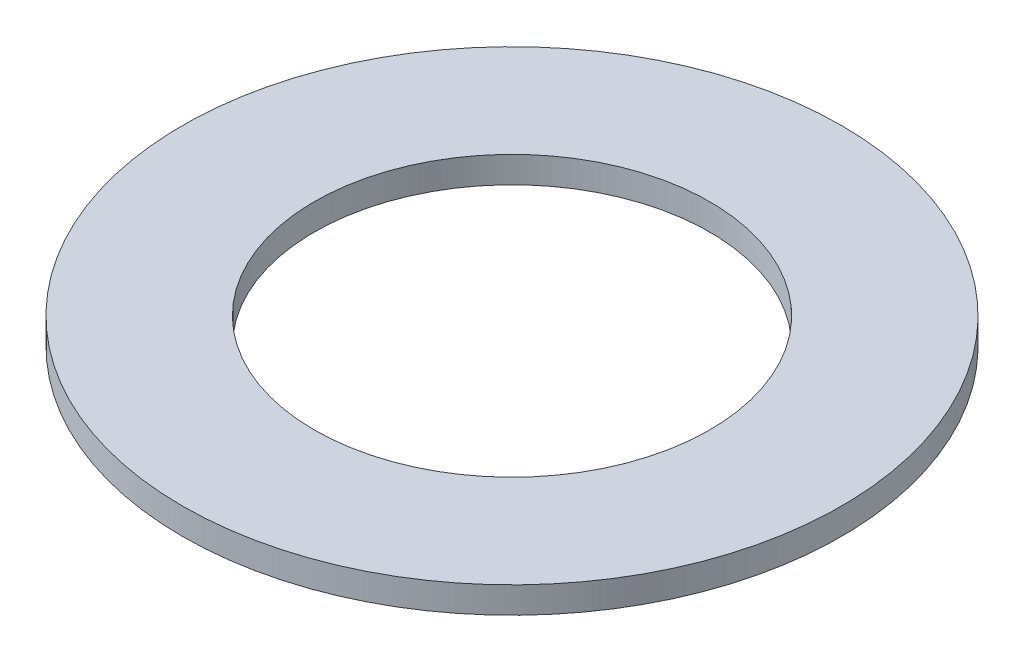
ISO-10303-21;
HEADER;
FILE_DESCRIPTION(('STEP AP214'),'2;1');
FILE_NAME('part.step','',(''),(''),'','','');
FILE_SCHEMA(('AUTOMOTIVE_DESIGN { 1 0 10303 214 1 1 1 1 }'));
ENDSEC;
DATA;
#1=APPLICATION_CONTEXT('core data for automotive mechanical design processes');
#2=APPLICATION_PROTOCOL_DEFINITION('international standard','automotive_design',2000,#1);
#3=PRODUCT_CONTEXT('',#1,'mechanical');
#4=PRODUCT('Part','Part','',(#3));
#5=PRODUCT_RELATED_PRODUCT_CATEGORY('part','',(#4));
#6=PRODUCT_DEFINITION_FORMATION('','',#4);
#7=PRODUCT_DEFINITION_CONTEXT('part definition',#1,'design');
#8=PRODUCT_DEFINITION('design','',#6,#7);
#9=PRODUCT_DEFINITION_SHAPE('','',#8);
#10=(LENGTH_UNIT() NAMED_UNIT(*) SI_UNIT(.MILLI.,.METRE.));
#11=(NAMED_UNIT(*) PLANE_ANGLE_UNIT() SI_UNIT($,.RADIAN.));
#12=(NAMED_UNIT(*) SI_UNIT($,.STERADIAN.) SOLID_ANGLE_UNIT());
#13=UNCERTAINTY_MEASURE_WITH_UNIT(LENGTH_MEASURE(1.E-05),#10,'distance_accuracy_value','');
#14=(GEOMETRIC_REPRESENTATION_CONTEXT(3) GLOBAL_UNCERTAINTY_ASSIGNED_CONTEXT((#13)) GLOBAL_UNIT_ASSIGNED_CONTEXT((#10,
#11,#12)) REPRESENTATION_CONTEXT('',''));
#15=CARTESIAN_POINT('',(0.,0.,0.));
#16=DIRECTION('',(0.,0.,1.));
#17=DIRECTION('',(1.,0.,0.));
#18=AXIS2_PLACEMENT_3D('',#15,#16,#17);
#19=CARTESIAN_POINT('',(0.,0.1,0.));
#20=DIRECTION('',(0.,1.,0.));
#21=DIRECTION('',(0.,0.,1.));
#22=AXIS2_PLACEMENT_3D('',#19,#20,#21);
#23=PLANE('',#22);
#24=CARTESIAN_POINT('',(0.,0.1,0.));
#25=DIRECTION('',(0.,1.,0.));
#26=DIRECTION('',(0.,0.,1.));
#27=AXIS2_PLACEMENT_3D('',#24,#25,#26);
#28=CIRCLE('',#27,2.5);
#29=CARTESIAN_POINT('',(0.,0.1,2.5));
#30=VERTEX_POINT('',#29);
#31=EDGE_CURVE('E10',#30,#30,#28,.T.);
#32=ORIENTED_EDGE('',*,*,#31,.T.);
#33=EDGE_LOOP('',(#32));
#34=FACE_BOUND('',#33,.T.);
#35=CARTESIAN_POINT('',(0.,0.1,0.));
#36=DIRECTION('',(0.,1.,0.));
#37=DIRECTION('',(0.,0.,1.));
#38=AXIS2_PLACEMENT_3D('',#35,#36,#37);
#39=CIRCLE('',#38,1.5);
#40=CARTESIAN_POINT('',(0.,0.1,1.5));
#41=VERTEX_POINT('',#40);
#42=EDGE_CURVE('E44',#41,#41,#39,.T.);
#43=ORIENTED_EDGE('',*,*,#42,.F.);
#44=EDGE_LOOP('',(#43));
#45=FACE_BOUND('',#44,.T.);
#46=ADVANCED_FACE('F33',(#34,#45),#23,.T.);
#47=CARTESIAN_POINT('',(0.,-0.1,0.));
#48=DIRECTION('',(0.,1.,0.));
#49=DIRECTION('',(0.,0.,1.));
#50=AXIS2_PLACEMENT_3D('',#47,#48,#49);
#51=PLANE('',#50);
#52=CARTESIAN_POINT('',(0.,-0.1,0.));
#53=DIRECTION('',(0.,1.,0.));
#54=DIRECTION('',(0.,0.,1.));
#55=AXIS2_PLACEMENT_3D('',#52,#53,#54);
#56=CIRCLE('',#55,2.5);
#57=CARTESIAN_POINT('',(0.,-0.1,2.5));
#58=VERTEX_POINT('',#57);
#59=EDGE_CURVE('E37',#58,#58,#56,.T.);
#60=ORIENTED_EDGE('',*,*,#59,.F.);
#61=EDGE_LOOP('',(#60));
#62=FACE_BOUND('',#61,.T.);
#63=CARTESIAN_POINT('',(0.,-0.1,0.));
#64=DIRECTION('',(0.,1.,0.));
#65=DIRECTION('',(0.,0.,1.));
#66=AXIS2_PLACEMENT_3D('',#63,#64,#65);
#67=CIRCLE('',#66,1.5);
#68=CARTESIAN_POINT('',(0.,-0.1,1.5));
#69=VERTEX_POINT('',#68);
#70=EDGE_CURVE('E46',#69,#69,#67,.T.);
#71=ORIENTED_EDGE('',*,*,#70,.T.);
#72=EDGE_LOOP('',(#71));
#73=FACE_BOUND('',#72,.T.);
#74=ADVANCED_FACE('F56',(#62,#73),#51,.F.);
#75=CARTESIAN_POINT('',(0.,0.1,0.));
#76=DIRECTION('',(0.,-1.,0.));
#77=DIRECTION('',(0.,0.,-1.));
#78=AXIS2_PLACEMENT_3D('',#75,#76,#77);
#79=CYLINDRICAL_SURFACE('',#78,2.5);
#80=ORIENTED_EDGE('',*,*,#31,.F.);
#81=EDGE_LOOP('',(#80));
#82=FACE_BOUND('',#81,.T.);
#83=ORIENTED_EDGE('',*,*,#59,.T.);
#84=EDGE_LOOP('',(#83));
#85=FACE_BOUND('',#84,.T.);
#86=ADVANCED_FACE('F35',(#82,#85),#79,.T.);
#87=CARTESIAN_POINT('',(0.,0.1,0.));
#88=DIRECTION('',(0.,-1.,0.));
#89=DIRECTION('',(0.,0.,-1.));
#90=AXIS2_PLACEMENT_3D('',#87,#88,#89);
#91=CYLINDRICAL_SURFACE('',#90,1.5);
#92=ORIENTED_EDGE('',*,*,#42,.T.);
#93=EDGE_LOOP('',(#92));
#94=FACE_BOUND('',#93,.T.);
#95=ORIENTED_EDGE('',*,*,#70,.F.);
#96=EDGE_LOOP('',(#95));
#97=FACE_BOUND('',#96,.T.);
#98=ADVANCED_FACE('F52',(#94,#97),#91,.F.);
#99=CLOSED_SHELL('',(#46,#74,#86,#98));
#100=MANIFOLD_SOLID_BREP('B2',#99);
#101=ADVANCED_BREP_SHAPE_REPRESENTATION('',(#18,#100),#14);
#102=SHAPE_DEFINITION_REPRESENTATION(#9,#101);
ENDSEC;
END-ISO-10303-21;
